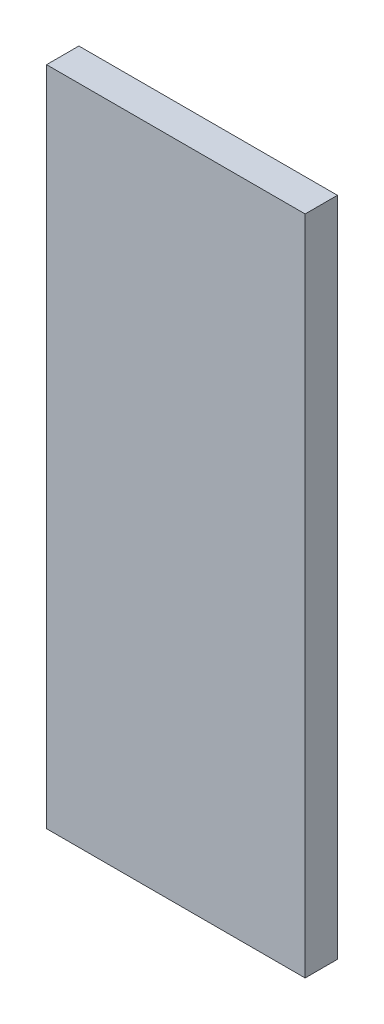
ISO-10303-21;
HEADER;
FILE_DESCRIPTION(('STEP AP214'),'2;1');
FILE_NAME('part.step','',(''),(''),'','','');
FILE_SCHEMA(('AUTOMOTIVE_DESIGN { 1 0 10303 214 1 1 1 1 }'));
ENDSEC;
DATA;
#1=APPLICATION_CONTEXT('core data for automotive mechanical design processes');
#2=APPLICATION_PROTOCOL_DEFINITION('international standard','automotive_design',2000,#1);
#3=PRODUCT_CONTEXT('',#1,'mechanical');
#4=PRODUCT('Part','Part','',(#3));
#5=PRODUCT_RELATED_PRODUCT_CATEGORY('part','',(#4));
#6=PRODUCT_DEFINITION_FORMATION('','',#4);
#7=PRODUCT_DEFINITION_CONTEXT('part definition',#1,'design');
#8=PRODUCT_DEFINITION('design','',#6,#7);
#9=PRODUCT_DEFINITION_SHAPE('','',#8);
#10=(LENGTH_UNIT() NAMED_UNIT(*) SI_UNIT(.MILLI.,.METRE.));
#11=(NAMED_UNIT(*) PLANE_ANGLE_UNIT() SI_UNIT($,.RADIAN.));
#12=(NAMED_UNIT(*) SI_UNIT($,.STERADIAN.) SOLID_ANGLE_UNIT());
#13=UNCERTAINTY_MEASURE_WITH_UNIT(LENGTH_MEASURE(1.E-05),#10,'distance_accuracy_value','');
#14=(GEOMETRIC_REPRESENTATION_CONTEXT(3) GLOBAL_UNCERTAINTY_ASSIGNED_CONTEXT((#13)) GLOBAL_UNIT_ASSIGNED_CONTEXT((#10,
#11,#12)) REPRESENTATION_CONTEXT('',''));
#15=CARTESIAN_POINT('',(0.,0.,0.));
#16=DIRECTION('',(0.,0.,1.));
#17=DIRECTION('',(1.,0.,0.));
#18=AXIS2_PLACEMENT_3D('',#15,#16,#17);
#19=CARTESIAN_POINT('',(-50.8,-130.,12.7));
#20=DIRECTION('',(1.,0.,0.));
#21=DIRECTION('',(0.,0.,-1.));
#22=AXIS2_PLACEMENT_3D('',#19,#20,#21);
#23=PLANE('',#22);
#24=DIRECTION('',(0.,-1.,0.));
#25=VECTOR('',#24,1.);
#26=CARTESIAN_POINT('',(-50.8,-130.,0.));
#27=LINE('',#26,#25);
#28=CARTESIAN_POINT('',(-50.8,130.,0.));
#29=VERTEX_POINT('',#28);
#30=CARTESIAN_POINT('',(-50.8,-130.,0.));
#31=VERTEX_POINT('',#30);
#32=EDGE_CURVE('E96',#29,#31,#27,.T.);
#33=ORIENTED_EDGE('',*,*,#32,.T.);
#34=DIRECTION('',(0.,0.,-1.));
#35=VECTOR('',#34,1.);
#36=CARTESIAN_POINT('',(-50.8,-130.,12.7));
#37=LINE('',#36,#35);
#38=CARTESIAN_POINT('',(-50.8,-130.,12.7));
#39=VERTEX_POINT('',#38);
#40=EDGE_CURVE('E11',#39,#31,#37,.T.);
#41=ORIENTED_EDGE('',*,*,#40,.F.);
#42=DIRECTION('',(0.,-1.,0.));
#43=VECTOR('',#42,1.);
#44=CARTESIAN_POINT('',(-50.8,-130.,12.7));
#45=LINE('',#44,#43);
#46=CARTESIAN_POINT('',(-50.8,130.,12.7));
#47=VERTEX_POINT('',#46);
#48=EDGE_CURVE('E84',#47,#39,#45,.T.);
#49=ORIENTED_EDGE('',*,*,#48,.F.);
#50=DIRECTION('',(0.,0.,-1.));
#51=VECTOR('',#50,1.);
#52=CARTESIAN_POINT('',(-50.8,130.,12.7));
#53=LINE('',#52,#51);
#54=EDGE_CURVE('E92',#47,#29,#53,.T.);
#55=ORIENTED_EDGE('',*,*,#54,.T.);
#56=EDGE_LOOP('',(#33,#41,#49,#55));
#57=FACE_BOUND('',#56,.T.);
#58=ADVANCED_FACE('F33',(#57),#23,.F.);
#59=CARTESIAN_POINT('',(50.8,-130.,12.7));
#60=DIRECTION('',(0.,1.,0.));
#61=DIRECTION('',(0.,0.,1.));
#62=AXIS2_PLACEMENT_3D('',#59,#60,#61);
#63=PLANE('',#62);
#64=DIRECTION('',(1.,0.,0.));
#65=VECTOR('',#64,1.);
#66=CARTESIAN_POINT('',(50.8,-130.,0.));
#67=LINE('',#66,#65);
#68=CARTESIAN_POINT('',(50.8,-130.,0.));
#69=VERTEX_POINT('',#68);
#70=EDGE_CURVE('E88',#31,#69,#67,.T.);
#71=ORIENTED_EDGE('',*,*,#70,.T.);
#72=DIRECTION('',(0.,0.,-1.));
#73=VECTOR('',#72,1.);
#74=CARTESIAN_POINT('',(50.8,-130.,12.7));
#75=LINE('',#74,#73);
#76=CARTESIAN_POINT('',(50.8,-130.,12.7));
#77=VERTEX_POINT('',#76);
#78=EDGE_CURVE('E41',#77,#69,#75,.T.);
#79=ORIENTED_EDGE('',*,*,#78,.F.);
#80=DIRECTION('',(1.,0.,0.));
#81=VECTOR('',#80,1.);
#82=CARTESIAN_POINT('',(50.8,-130.,12.7));
#83=LINE('',#82,#81);
#84=EDGE_CURVE('E79',#39,#77,#83,.T.);
#85=ORIENTED_EDGE('',*,*,#84,.F.);
#86=ORIENTED_EDGE('',*,*,#40,.T.);
#87=EDGE_LOOP('',(#71,#79,#85,#86));
#88=FACE_BOUND('',#87,.T.);
#89=ADVANCED_FACE('F87',(#88),#63,.F.);
#90=CARTESIAN_POINT('',(50.8,-130.,12.7));
#91=DIRECTION('',(-1.,0.,0.));
#92=DIRECTION('',(0.,0.,1.));
#93=AXIS2_PLACEMENT_3D('',#90,#91,#92);
#94=PLANE('',#93);
#95=DIRECTION('',(0.,1.,0.));
#96=VECTOR('',#95,1.);
#97=CARTESIAN_POINT('',(50.8,-130.,0.));
#98=LINE('',#97,#96);
#99=CARTESIAN_POINT('',(50.8,130.,0.));
#100=VERTEX_POINT('',#99);
#101=EDGE_CURVE('E66',#69,#100,#98,.T.);
#102=ORIENTED_EDGE('',*,*,#101,.T.);
#103=DIRECTION('',(0.,0.,-1.));
#104=VECTOR('',#103,1.);
#105=CARTESIAN_POINT('',(50.8,130.,12.7));
#106=LINE('',#105,#104);
#107=CARTESIAN_POINT('',(50.8,130.,12.7));
#108=VERTEX_POINT('',#107);
#109=EDGE_CURVE('E89',#108,#100,#106,.T.);
#110=ORIENTED_EDGE('',*,*,#109,.F.);
#111=DIRECTION('',(0.,1.,0.));
#112=VECTOR('',#111,1.);
#113=CARTESIAN_POINT('',(50.8,-130.,12.7));
#114=LINE('',#113,#112);
#115=EDGE_CURVE('E82',#77,#108,#114,.T.);
#116=ORIENTED_EDGE('',*,*,#115,.F.);
#117=ORIENTED_EDGE('',*,*,#78,.T.);
#118=EDGE_LOOP('',(#102,#110,#116,#117));
#119=FACE_BOUND('',#118,.T.);
#120=ADVANCED_FACE('F90',(#119),#94,.F.);
#121=CARTESIAN_POINT('',(50.8,130.,12.7));
#122=DIRECTION('',(0.,-1.,0.));
#123=DIRECTION('',(0.,0.,-1.));
#124=AXIS2_PLACEMENT_3D('',#121,#122,#123);
#125=PLANE('',#124);
#126=DIRECTION('',(-1.,0.,0.));
#127=VECTOR('',#126,1.);
#128=CARTESIAN_POINT('',(50.8,130.,0.));
#129=LINE('',#128,#127);
#130=EDGE_CURVE('E72',#100,#29,#129,.T.);
#131=ORIENTED_EDGE('',*,*,#130,.T.);
#132=ORIENTED_EDGE('',*,*,#54,.F.);
#133=DIRECTION('',(-1.,0.,0.));
#134=VECTOR('',#133,1.);
#135=CARTESIAN_POINT('',(50.8,130.,12.7));
#136=LINE('',#135,#134);
#137=EDGE_CURVE('E49',#108,#47,#136,.T.);
#138=ORIENTED_EDGE('',*,*,#137,.F.);
#139=ORIENTED_EDGE('',*,*,#109,.T.);
#140=EDGE_LOOP('',(#131,#132,#138,#139));
#141=FACE_BOUND('',#140,.T.);
#142=ADVANCED_FACE('F103',(#141),#125,.F.);
#143=CARTESIAN_POINT('',(0.,0.,12.7));
#144=DIRECTION('',(0.,0.,1.));
#145=DIRECTION('',(1.,0.,0.));
#146=AXIS2_PLACEMENT_3D('',#143,#144,#145);
#147=PLANE('',#146);
#148=ORIENTED_EDGE('',*,*,#48,.T.);
#149=ORIENTED_EDGE('',*,*,#84,.T.);
#150=ORIENTED_EDGE('',*,*,#115,.T.);
#151=ORIENTED_EDGE('',*,*,#137,.T.);
#152=EDGE_LOOP('',(#148,#149,#150,#151));
#153=FACE_BOUND('',#152,.T.);
#154=ADVANCED_FACE('F80',(#153),#147,.T.);
#155=CARTESIAN_POINT('',(0.,0.,0.));
#156=DIRECTION('',(0.,0.,1.));
#157=DIRECTION('',(1.,0.,0.));
#158=AXIS2_PLACEMENT_3D('',#155,#156,#157);
#159=PLANE('',#158);
#160=ORIENTED_EDGE('',*,*,#32,.F.);
#161=ORIENTED_EDGE('',*,*,#130,.F.);
#162=ORIENTED_EDGE('',*,*,#101,.F.);
#163=ORIENTED_EDGE('',*,*,#70,.F.);
#164=EDGE_LOOP('',(#160,#161,#162,#163));
#165=FACE_BOUND('',#164,.T.);
#166=ADVANCED_FACE('F106',(#165),#159,.F.);
#167=CLOSED_SHELL('',(#58,#89,#120,#142,#154,#166));
#168=MANIFOLD_SOLID_BREP('B2',#167);
#169=ADVANCED_BREP_SHAPE_REPRESENTATION('',(#18,#168),#14);
#170=SHAPE_DEFINITION_REPRESENTATION(#9,#169);
ENDSEC;
END-ISO-10303-21;
